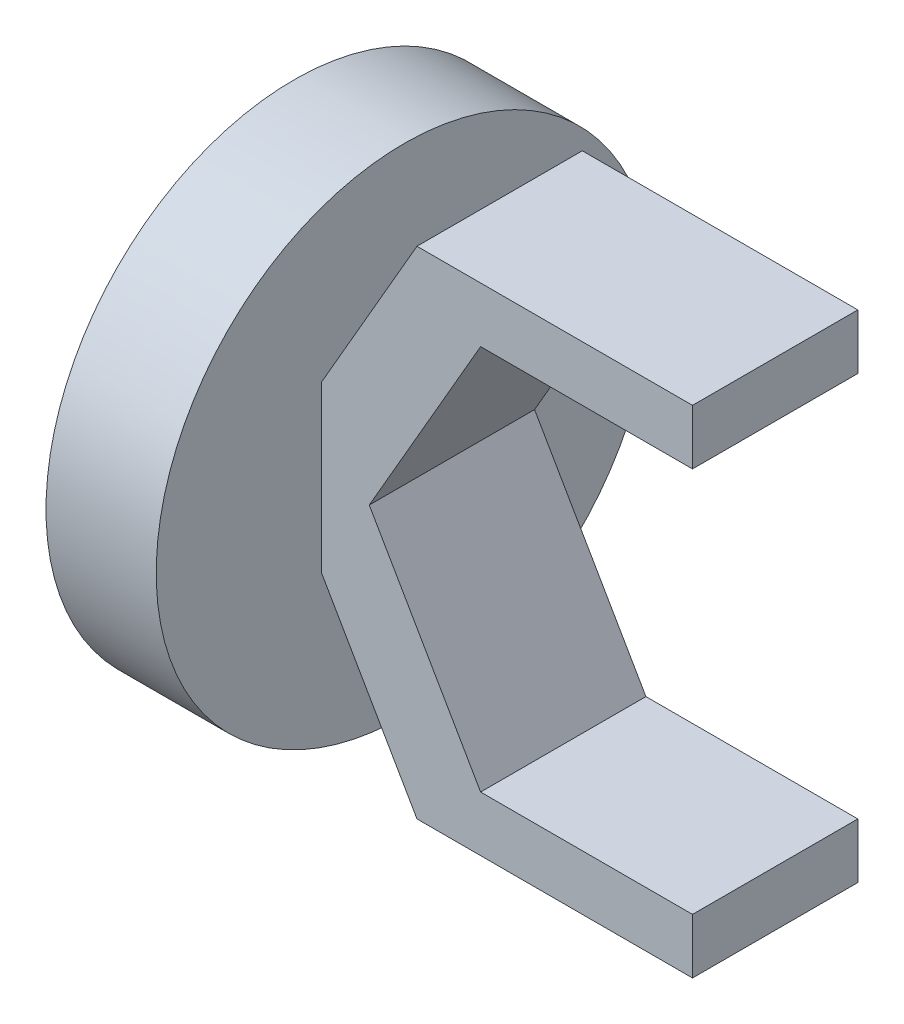
ISO-10303-21;
HEADER;
FILE_DESCRIPTION(('STEP AP214'),'2;1');
FILE_NAME('part.step','',(''),(''),'','','');
FILE_SCHEMA(('AUTOMOTIVE_DESIGN { 1 0 10303 214 1 1 1 1 }'));
ENDSEC;
DATA;
#1=APPLICATION_CONTEXT('core data for automotive mechanical design processes');
#2=APPLICATION_PROTOCOL_DEFINITION('international standard','automotive_design',2000,#1);
#3=PRODUCT_CONTEXT('',#1,'mechanical');
#4=PRODUCT('Part','Part','',(#3));
#5=PRODUCT_RELATED_PRODUCT_CATEGORY('part','',(#4));
#6=PRODUCT_DEFINITION_FORMATION('','',#4);
#7=PRODUCT_DEFINITION_CONTEXT('part definition',#1,'design');
#8=PRODUCT_DEFINITION('design','',#6,#7);
#9=PRODUCT_DEFINITION_SHAPE('','',#8);
#10=(LENGTH_UNIT() NAMED_UNIT(*) SI_UNIT(.MILLI.,.METRE.));
#11=(NAMED_UNIT(*) PLANE_ANGLE_UNIT() SI_UNIT($,.RADIAN.));
#12=(NAMED_UNIT(*) SI_UNIT($,.STERADIAN.) SOLID_ANGLE_UNIT());
#13=UNCERTAINTY_MEASURE_WITH_UNIT(LENGTH_MEASURE(1.E-05),#10,'distance_accuracy_value','');
#14=(GEOMETRIC_REPRESENTATION_CONTEXT(3) GLOBAL_UNCERTAINTY_ASSIGNED_CONTEXT((#13)) GLOBAL_UNIT_ASSIGNED_CONTEXT((#10,
#11,#12)) REPRESENTATION_CONTEXT('',''));
#15=CARTESIAN_POINT('',(0.,0.,0.));
#16=DIRECTION('',(0.,0.,1.));
#17=DIRECTION('',(1.,0.,0.));
#18=AXIS2_PLACEMENT_3D('',#15,#16,#17);
#19=CARTESIAN_POINT('',(20.,0.,0.));
#20=DIRECTION('',(1.,0.,0.));
#21=DIRECTION('',(0.,0.,-1.));
#22=AXIS2_PLACEMENT_3D('',#19,#20,#21);
#23=PLANE('',#22);
#24=CARTESIAN_POINT('',(20.,0.,0.));
#25=DIRECTION('',(1.,0.,0.));
#26=DIRECTION('',(0.,0.,-1.));
#27=AXIS2_PLACEMENT_3D('',#24,#25,#26);
#28=CIRCLE('',#27,45.);
#29=CARTESIAN_POINT('',(20.,0.,-45.));
#30=VERTEX_POINT('',#29);
#31=EDGE_CURVE('E11',#30,#30,#28,.T.);
#32=ORIENTED_EDGE('',*,*,#31,.T.);
#33=EDGE_LOOP('',(#32));
#34=FACE_BOUND('',#33,.T.);
#35=DIRECTION('',(0.,0.,1.));
#36=VECTOR('',#35,1.);
#37=CARTESIAN_POINT('',(20.,15.,-15.));
#38=LINE('',#37,#36);
#39=CARTESIAN_POINT('',(20.,14.9999999999999,-15.));
#40=VERTEX_POINT('',#39);
#41=CARTESIAN_POINT('',(20.,15.,15.));
#42=VERTEX_POINT('',#41);
#43=EDGE_CURVE('E55',#40,#42,#38,.T.);
#44=ORIENTED_EDGE('',*,*,#43,.F.);
#45=DIRECTION('',(0.,-1.,0.));
#46=VECTOR('',#45,1.);
#47=CARTESIAN_POINT('',(20.,15.,-15.));
#48=LINE('',#47,#46);
#49=CARTESIAN_POINT('',(20.,-15.,-15.));
#50=VERTEX_POINT('',#49);
#51=EDGE_CURVE('E59',#40,#50,#48,.T.);
#52=ORIENTED_EDGE('',*,*,#51,.T.);
#53=DIRECTION('',(0.,0.,1.));
#54=VECTOR('',#53,1.);
#55=CARTESIAN_POINT('',(20.,-15.,-15.));
#56=LINE('',#55,#54);
#57=CARTESIAN_POINT('',(20.,-15.,15.));
#58=VERTEX_POINT('',#57);
#59=EDGE_CURVE('E118',#50,#58,#56,.T.);
#60=ORIENTED_EDGE('',*,*,#59,.T.);
#61=DIRECTION('',(0.,-1.,0.));
#62=VECTOR('',#61,1.);
#63=CARTESIAN_POINT('',(20.,15.,15.));
#64=LINE('',#63,#62);
#65=EDGE_CURVE('E121',#42,#58,#64,.T.);
#66=ORIENTED_EDGE('',*,*,#65,.F.);
#67=EDGE_LOOP('',(#44,#52,#60,#66));
#68=FACE_BOUND('',#67,.T.);
#69=ADVANCED_FACE('F39',(#34,#68),#23,.T.);
#70=CARTESIAN_POINT('',(0.,0.,0.));
#71=DIRECTION('',(1.,0.,0.));
#72=DIRECTION('',(0.,0.,-1.));
#73=AXIS2_PLACEMENT_3D('',#70,#71,#72);
#74=PLANE('',#73);
#75=CARTESIAN_POINT('',(0.,0.,0.));
#76=DIRECTION('',(1.,0.,0.));
#77=DIRECTION('',(0.,0.,-1.));
#78=AXIS2_PLACEMENT_3D('',#75,#76,#77);
#79=CIRCLE('',#78,45.);
#80=CARTESIAN_POINT('',(0.,0.,-45.));
#81=VERTEX_POINT('',#80);
#82=EDGE_CURVE('E43',#81,#81,#79,.T.);
#83=ORIENTED_EDGE('',*,*,#82,.F.);
#84=EDGE_LOOP('',(#83));
#85=FACE_BOUND('',#84,.T.);
#86=CARTESIAN_POINT('',(0.,0.,0.));
#87=DIRECTION('',(1.,0.,0.));
#88=DIRECTION('',(0.,0.,-1.));
#89=AXIS2_PLACEMENT_3D('',#86,#87,#88);
#90=CIRCLE('',#89,10.);
#91=CARTESIAN_POINT('',(0.,0.,-10.));
#92=VERTEX_POINT('',#91);
#93=EDGE_CURVE('E249',#92,#92,#90,.T.);
#94=ORIENTED_EDGE('',*,*,#93,.T.);
#95=EDGE_LOOP('',(#94));
#96=FACE_BOUND('',#95,.T.);
#97=ADVANCED_FACE('F259',(#85,#96),#74,.F.);
#98=CARTESIAN_POINT('',(20.,0.,0.));
#99=DIRECTION('',(-1.,0.,0.));
#100=DIRECTION('',(0.,0.,1.));
#101=AXIS2_PLACEMENT_3D('',#98,#99,#100);
#102=CYLINDRICAL_SURFACE('',#101,45.);
#103=ORIENTED_EDGE('',*,*,#31,.F.);
#104=EDGE_LOOP('',(#103));
#105=FACE_BOUND('',#104,.T.);
#106=ORIENTED_EDGE('',*,*,#82,.T.);
#107=EDGE_LOOP('',(#106));
#108=FACE_BOUND('',#107,.T.);
#109=ADVANCED_FACE('F41',(#105,#108),#102,.T.);
#110=CARTESIAN_POINT('',(20.,0.,0.));
#111=DIRECTION('',(-1.,0.,0.));
#112=DIRECTION('',(0.,0.,1.));
#113=AXIS2_PLACEMENT_3D('',#110,#111,#112);
#114=CYLINDRICAL_SURFACE('',#113,10.);
#115=CARTESIAN_POINT('',(20.,0.,0.));
#116=DIRECTION('',(-1.,0.,0.));
#117=DIRECTION('',(0.,-1.,0.));
#118=AXIS2_PLACEMENT_3D('',#115,#116,#117);
#119=CIRCLE('',#118,10.);
#120=CARTESIAN_POINT('',(20.,-10.,0.));
#121=VERTEX_POINT('',#120);
#122=EDGE_CURVE('E219',#121,#121,#119,.T.);
#123=ORIENTED_EDGE('',*,*,#122,.F.);
#124=EDGE_LOOP('',(#123));
#125=FACE_BOUND('',#124,.T.);
#126=ORIENTED_EDGE('',*,*,#93,.F.);
#127=EDGE_LOOP('',(#126));
#128=FACE_BOUND('',#127,.T.);
#129=ADVANCED_FACE('F265',(#125,#128),#114,.F.);
#130=CARTESIAN_POINT('',(20.,15.,-15.));
#131=DIRECTION('',(-1.,0.,0.));
#132=DIRECTION('',(0.,-1.,0.));
#133=AXIS2_PLACEMENT_3D('',#130,#131,#132);
#134=PLANE('',#133);
#135=ORIENTED_EDGE('',*,*,#122,.T.);
#136=EDGE_LOOP('',(#135));
#137=FACE_BOUND('',#136,.T.);
#138=ADVANCED_FACE('F272',(#137),#134,.T.);
#139=CARTESIAN_POINT('',(20.,15.,-15.));
#140=DIRECTION('',(-0.866025403784437,0.500000000000003,0.));
#141=DIRECTION('',(-0.500000000000003,-0.866025403784437,0.));
#142=AXIS2_PLACEMENT_3D('',#139,#140,#141);
#143=PLANE('',#142);
#144=ORIENTED_EDGE('',*,*,#43,.T.);
#145=DIRECTION('',(-0.500000000000003,-0.866025403784437,0.));
#146=VECTOR('',#145,1.);
#147=CARTESIAN_POINT('',(20.,15.,15.));
#148=LINE('',#147,#146);
#149=CARTESIAN_POINT('',(37.3205080756889,44.9999999999999,15.));
#150=VERTEX_POINT('',#149);
#151=EDGE_CURVE('E142',#150,#42,#148,.T.);
#152=ORIENTED_EDGE('',*,*,#151,.F.);
#153=DIRECTION('',(0.,0.,1.));
#154=VECTOR('',#153,1.);
#155=CARTESIAN_POINT('',(37.3205080756889,44.9999999999999,-15.));
#156=LINE('',#155,#154);
#157=CARTESIAN_POINT('',(37.3205080756889,44.9999999999999,-15.));
#158=VERTEX_POINT('',#157);
#159=EDGE_CURVE('E220',#158,#150,#156,.T.);
#160=ORIENTED_EDGE('',*,*,#159,.F.);
#161=DIRECTION('',(-0.500000000000003,-0.866025403784437,0.));
#162=VECTOR('',#161,1.);
#163=CARTESIAN_POINT('',(20.,15.,-15.));
#164=LINE('',#163,#162);
#165=EDGE_CURVE('E127',#158,#40,#164,.T.);
#166=ORIENTED_EDGE('',*,*,#165,.T.);
#167=EDGE_LOOP('',(#144,#152,#160,#166));
#168=FACE_BOUND('',#167,.T.);
#169=ADVANCED_FACE('F276',(#168),#143,.T.);
#170=CARTESIAN_POINT('',(37.3205080756889,44.9999999999999,-15.));
#171=DIRECTION('',(0.,1.,0.));
#172=DIRECTION('',(-1.,0.,0.));
#173=AXIS2_PLACEMENT_3D('',#170,#171,#172);
#174=PLANE('',#173);
#175=ORIENTED_EDGE('',*,*,#159,.T.);
#176=DIRECTION('',(-1.,0.,0.));
#177=VECTOR('',#176,1.);
#178=CARTESIAN_POINT('',(37.3205080756889,44.9999999999999,15.));
#179=LINE('',#178,#177);
#180=CARTESIAN_POINT('',(87.3205080756889,44.9999999999997,15.));
#181=VERTEX_POINT('',#180);
#182=EDGE_CURVE('E172',#181,#150,#179,.T.);
#183=ORIENTED_EDGE('',*,*,#182,.F.);
#184=DIRECTION('',(0.,0.,1.));
#185=VECTOR('',#184,1.);
#186=CARTESIAN_POINT('',(87.3205080756889,44.9999999999997,-15.));
#187=LINE('',#186,#185);
#188=CARTESIAN_POINT('',(87.3205080756889,44.9999999999997,-15.));
#189=VERTEX_POINT('',#188);
#190=EDGE_CURVE('E223',#189,#181,#187,.T.);
#191=ORIENTED_EDGE('',*,*,#190,.F.);
#192=DIRECTION('',(-1.,0.,0.));
#193=VECTOR('',#192,1.);
#194=CARTESIAN_POINT('',(37.3205080756889,44.9999999999999,-15.));
#195=LINE('',#194,#193);
#196=EDGE_CURVE('E210',#189,#158,#195,.T.);
#197=ORIENTED_EDGE('',*,*,#196,.T.);
#198=EDGE_LOOP('',(#175,#183,#191,#197));
#199=FACE_BOUND('',#198,.T.);
#200=ADVANCED_FACE('F308',(#199),#174,.T.);
#201=CARTESIAN_POINT('',(87.3205080756889,44.9999999999997,-15.));
#202=DIRECTION('',(1.,0.,0.));
#203=DIRECTION('',(0.,1.,0.));
#204=AXIS2_PLACEMENT_3D('',#201,#202,#203);
#205=PLANE('',#204);
#206=ORIENTED_EDGE('',*,*,#190,.T.);
#207=DIRECTION('',(0.,1.,0.));
#208=VECTOR('',#207,1.);
#209=CARTESIAN_POINT('',(87.3205080756889,44.9999999999997,15.));
#210=LINE('',#209,#208);
#211=CARTESIAN_POINT('',(87.3205080756889,34.9999999999997,15.));
#212=VERTEX_POINT('',#211);
#213=EDGE_CURVE('E168',#212,#181,#210,.T.);
#214=ORIENTED_EDGE('',*,*,#213,.F.);
#215=DIRECTION('',(0.,0.,1.));
#216=VECTOR('',#215,1.);
#217=CARTESIAN_POINT('',(87.3205080756889,34.9999999999997,-15.));
#218=LINE('',#217,#216);
#219=CARTESIAN_POINT('',(87.3205080756889,34.9999999999997,-15.));
#220=VERTEX_POINT('',#219);
#221=EDGE_CURVE('E226',#220,#212,#218,.T.);
#222=ORIENTED_EDGE('',*,*,#221,.F.);
#223=DIRECTION('',(0.,1.,0.));
#224=VECTOR('',#223,1.);
#225=CARTESIAN_POINT('',(87.3205080756889,44.9999999999997,-15.));
#226=LINE('',#225,#224);
#227=EDGE_CURVE('E206',#220,#189,#226,.T.);
#228=ORIENTED_EDGE('',*,*,#227,.T.);
#229=EDGE_LOOP('',(#206,#214,#222,#228));
#230=FACE_BOUND('',#229,.T.);
#231=ADVANCED_FACE('F304',(#230),#205,.T.);
#232=CARTESIAN_POINT('',(48.8675134594814,34.9999999999999,-15.));
#233=DIRECTION('',(0.,-1.,0.));
#234=DIRECTION('',(1.,0.,0.));
#235=AXIS2_PLACEMENT_3D('',#232,#233,#234);
#236=PLANE('',#235);
#237=ORIENTED_EDGE('',*,*,#221,.T.);
#238=DIRECTION('',(1.,0.,0.));
#239=VECTOR('',#238,1.);
#240=CARTESIAN_POINT('',(48.8675134594814,34.9999999999999,15.));
#241=LINE('',#240,#239);
#242=CARTESIAN_POINT('',(48.8675134594814,34.9999999999999,15.));
#243=VERTEX_POINT('',#242);
#244=EDGE_CURVE('E164',#243,#212,#241,.T.);
#245=ORIENTED_EDGE('',*,*,#244,.F.);
#246=DIRECTION('',(0.,0.,1.));
#247=VECTOR('',#246,1.);
#248=CARTESIAN_POINT('',(48.8675134594814,34.9999999999999,-15.));
#249=LINE('',#248,#247);
#250=CARTESIAN_POINT('',(48.8675134594814,34.9999999999999,-15.));
#251=VERTEX_POINT('',#250);
#252=EDGE_CURVE('E229',#251,#243,#249,.T.);
#253=ORIENTED_EDGE('',*,*,#252,.F.);
#254=DIRECTION('',(1.,0.,0.));
#255=VECTOR('',#254,1.);
#256=CARTESIAN_POINT('',(48.8675134594814,34.9999999999999,-15.));
#257=LINE('',#256,#255);
#258=EDGE_CURVE('E202',#251,#220,#257,.T.);
#259=ORIENTED_EDGE('',*,*,#258,.T.);
#260=EDGE_LOOP('',(#237,#245,#253,#259));
#261=FACE_BOUND('',#260,.T.);
#262=ADVANCED_FACE('F300',(#261),#236,.T.);
#263=CARTESIAN_POINT('',(48.8675134594814,34.9999999999999,-15.));
#264=DIRECTION('',(0.866025403784067,-0.500000000000644,0.));
#265=DIRECTION('',(0.500000000000644,0.866025403784067,0.));
#266=AXIS2_PLACEMENT_3D('',#263,#264,#265);
#267=PLANE('',#266);
#268=ORIENTED_EDGE('',*,*,#252,.T.);
#269=DIRECTION('',(0.500000000000644,0.866025403784067,0.));
#270=VECTOR('',#269,1.);
#271=CARTESIAN_POINT('',(48.8675134594814,34.9999999999999,15.));
#272=LINE('',#271,#270);
#273=CARTESIAN_POINT('',(28.6602540378169,1.22469986625975E-11,15.));
#274=VERTEX_POINT('',#273);
#275=EDGE_CURVE('E160',#274,#243,#272,.T.);
#276=ORIENTED_EDGE('',*,*,#275,.F.);
#277=DIRECTION('',(0.,0.,1.));
#278=VECTOR('',#277,1.);
#279=CARTESIAN_POINT('',(28.6602540378169,1.22469986625975E-11,-15.));
#280=LINE('',#279,#278);
#281=CARTESIAN_POINT('',(28.6602540378169,1.22469986625975E-11,-15.));
#282=VERTEX_POINT('',#281);
#283=EDGE_CURVE('E232',#282,#274,#280,.T.);
#284=ORIENTED_EDGE('',*,*,#283,.F.);
#285=DIRECTION('',(0.500000000000644,0.866025403784067,0.));
#286=VECTOR('',#285,1.);
#287=CARTESIAN_POINT('',(48.8675134594814,34.9999999999999,-15.));
#288=LINE('',#287,#286);
#289=EDGE_CURVE('E198',#282,#251,#288,.T.);
#290=ORIENTED_EDGE('',*,*,#289,.T.);
#291=EDGE_LOOP('',(#268,#276,#284,#290));
#292=FACE_BOUND('',#291,.T.);
#293=ADVANCED_FACE('F296',(#292),#267,.T.);
#294=CARTESIAN_POINT('',(48.8675134594813,-35.,-15.));
#295=DIRECTION('',(0.86602540378422,0.500000000000379,0.));
#296=DIRECTION('',(-0.500000000000379,0.86602540378422,0.));
#297=AXIS2_PLACEMENT_3D('',#294,#295,#296);
#298=PLANE('',#297);
#299=ORIENTED_EDGE('',*,*,#283,.T.);
#300=DIRECTION('',(-0.500000000000379,0.86602540378422,0.));
#301=VECTOR('',#300,1.);
#302=CARTESIAN_POINT('',(48.8675134594813,-35.,15.));
#303=LINE('',#302,#301);
#304=CARTESIAN_POINT('',(48.8675134594813,-35.,15.));
#305=VERTEX_POINT('',#304);
#306=EDGE_CURVE('E156',#305,#274,#303,.T.);
#307=ORIENTED_EDGE('',*,*,#306,.F.);
#308=DIRECTION('',(0.,0.,1.));
#309=VECTOR('',#308,1.);
#310=CARTESIAN_POINT('',(48.8675134594813,-35.,-15.));
#311=LINE('',#310,#309);
#312=CARTESIAN_POINT('',(48.8675134594813,-35.,-15.));
#313=VERTEX_POINT('',#312);
#314=EDGE_CURVE('E235',#313,#305,#311,.T.);
#315=ORIENTED_EDGE('',*,*,#314,.F.);
#316=DIRECTION('',(-0.500000000000379,0.86602540378422,0.));
#317=VECTOR('',#316,1.);
#318=CARTESIAN_POINT('',(48.8675134594813,-35.,-15.));
#319=LINE('',#318,#317);
#320=EDGE_CURVE('E194',#313,#282,#319,.T.);
#321=ORIENTED_EDGE('',*,*,#320,.T.);
#322=EDGE_LOOP('',(#299,#307,#315,#321));
#323=FACE_BOUND('',#322,.T.);
#324=ADVANCED_FACE('F292',(#323),#298,.T.);
#325=CARTESIAN_POINT('',(48.8675134594813,-35.,-15.));
#326=DIRECTION('',(0.,1.,0.));
#327=DIRECTION('',(0.,0.,1.));
#328=AXIS2_PLACEMENT_3D('',#325,#326,#327);
#329=PLANE('',#328);
#330=ORIENTED_EDGE('',*,*,#314,.T.);
#331=DIRECTION('',(-1.,0.,0.));
#332=VECTOR('',#331,1.);
#333=CARTESIAN_POINT('',(48.8675134594813,-35.,15.));
#334=LINE('',#333,#332);
#335=CARTESIAN_POINT('',(87.3205080756888,-35.,15.));
#336=VERTEX_POINT('',#335);
#337=EDGE_CURVE('E152',#336,#305,#334,.T.);
#338=ORIENTED_EDGE('',*,*,#337,.F.);
#339=DIRECTION('',(0.,0.,1.));
#340=VECTOR('',#339,1.);
#341=CARTESIAN_POINT('',(87.3205080756888,-35.,-15.));
#342=LINE('',#341,#340);
#343=CARTESIAN_POINT('',(87.3205080756888,-35.,-15.));
#344=VERTEX_POINT('',#343);
#345=EDGE_CURVE('E238',#344,#336,#342,.T.);
#346=ORIENTED_EDGE('',*,*,#345,.F.);
#347=DIRECTION('',(-1.,0.,0.));
#348=VECTOR('',#347,1.);
#349=CARTESIAN_POINT('',(48.8675134594813,-35.,-15.));
#350=LINE('',#349,#348);
#351=EDGE_CURVE('E190',#344,#313,#350,.T.);
#352=ORIENTED_EDGE('',*,*,#351,.T.);
#353=EDGE_LOOP('',(#330,#338,#346,#352));
#354=FACE_BOUND('',#353,.T.);
#355=ADVANCED_FACE('F288',(#354),#329,.T.);
#356=CARTESIAN_POINT('',(87.3205080756888,-45.,-15.));
#357=DIRECTION('',(1.,0.,0.));
#358=DIRECTION('',(0.,0.,-1.));
#359=AXIS2_PLACEMENT_3D('',#356,#357,#358);
#360=PLANE('',#359);
#361=ORIENTED_EDGE('',*,*,#345,.T.);
#362=DIRECTION('',(0.,1.,0.));
#363=VECTOR('',#362,1.);
#364=CARTESIAN_POINT('',(87.3205080756888,-45.,15.));
#365=LINE('',#364,#363);
#366=CARTESIAN_POINT('',(87.3205080756888,-45.,15.));
#367=VERTEX_POINT('',#366);
#368=EDGE_CURVE('E148',#367,#336,#365,.T.);
#369=ORIENTED_EDGE('',*,*,#368,.F.);
#370=DIRECTION('',(0.,0.,1.));
#371=VECTOR('',#370,1.);
#372=CARTESIAN_POINT('',(87.3205080756888,-45.,-15.));
#373=LINE('',#372,#371);
#374=CARTESIAN_POINT('',(87.3205080756888,-45.,-15.));
#375=VERTEX_POINT('',#374);
#376=EDGE_CURVE('E241',#375,#367,#373,.T.);
#377=ORIENTED_EDGE('',*,*,#376,.F.);
#378=DIRECTION('',(0.,1.,0.));
#379=VECTOR('',#378,1.);
#380=CARTESIAN_POINT('',(87.3205080756888,-45.,-15.));
#381=LINE('',#380,#379);
#382=EDGE_CURVE('E186',#375,#344,#381,.T.);
#383=ORIENTED_EDGE('',*,*,#382,.T.);
#384=EDGE_LOOP('',(#361,#369,#377,#383));
#385=FACE_BOUND('',#384,.T.);
#386=ADVANCED_FACE('F284',(#385),#360,.T.);
#387=CARTESIAN_POINT('',(37.3205080756888,-45.,-15.));
#388=DIRECTION('',(0.,-1.,0.));
#389=DIRECTION('',(0.,0.,-1.));
#390=AXIS2_PLACEMENT_3D('',#387,#388,#389);
#391=PLANE('',#390);
#392=ORIENTED_EDGE('',*,*,#376,.T.);
#393=DIRECTION('',(1.,0.,0.));
#394=VECTOR('',#393,1.);
#395=CARTESIAN_POINT('',(37.3205080756888,-45.,15.));
#396=LINE('',#395,#394);
#397=CARTESIAN_POINT('',(37.3205080756888,-45.,15.));
#398=VERTEX_POINT('',#397);
#399=EDGE_CURVE('E136',#398,#367,#396,.T.);
#400=ORIENTED_EDGE('',*,*,#399,.F.);
#401=DIRECTION('',(0.,0.,1.));
#402=VECTOR('',#401,1.);
#403=CARTESIAN_POINT('',(37.3205080756888,-45.,-15.));
#404=LINE('',#403,#402);
#405=CARTESIAN_POINT('',(37.3205080756888,-45.,-15.));
#406=VERTEX_POINT('',#405);
#407=EDGE_CURVE('E126',#406,#398,#404,.T.);
#408=ORIENTED_EDGE('',*,*,#407,.F.);
#409=DIRECTION('',(1.,0.,0.));
#410=VECTOR('',#409,1.);
#411=CARTESIAN_POINT('',(37.3205080756888,-45.,-15.));
#412=LINE('',#411,#410);
#413=EDGE_CURVE('E182',#406,#375,#412,.T.);
#414=ORIENTED_EDGE('',*,*,#413,.T.);
#415=EDGE_LOOP('',(#392,#400,#408,#414));
#416=FACE_BOUND('',#415,.T.);
#417=ADVANCED_FACE('F281',(#416),#391,.T.);
#418=CARTESIAN_POINT('',(20.,-15.,-15.));
#419=DIRECTION('',(-0.866025403784439,-0.5,0.));
#420=DIRECTION('',(0.5,-0.866025403784439,0.));
#421=AXIS2_PLACEMENT_3D('',#418,#419,#420);
#422=PLANE('',#421);
#423=ORIENTED_EDGE('',*,*,#407,.T.);
#424=DIRECTION('',(0.5,-0.866025403784439,0.));
#425=VECTOR('',#424,1.);
#426=CARTESIAN_POINT('',(20.,-15.,15.));
#427=LINE('',#426,#425);
#428=EDGE_CURVE('E130',#58,#398,#427,.T.);
#429=ORIENTED_EDGE('',*,*,#428,.F.);
#430=ORIENTED_EDGE('',*,*,#59,.F.);
#431=DIRECTION('',(0.5,-0.866025403784439,0.));
#432=VECTOR('',#431,1.);
#433=CARTESIAN_POINT('',(20.,-15.,-15.));
#434=LINE('',#433,#432);
#435=EDGE_CURVE('E179',#50,#406,#434,.T.);
#436=ORIENTED_EDGE('',*,*,#435,.T.);
#437=EDGE_LOOP('',(#423,#429,#430,#436));
#438=FACE_BOUND('',#437,.T.);
#439=ADVANCED_FACE('F131',(#438),#422,.T.);
#440=CARTESIAN_POINT('',(0.,0.,-15.));
#441=DIRECTION('',(0.,0.,1.));
#442=DIRECTION('',(1.,0.,0.));
#443=AXIS2_PLACEMENT_3D('',#440,#441,#442);
#444=PLANE('',#443);
#445=ORIENTED_EDGE('',*,*,#51,.F.);
#446=ORIENTED_EDGE('',*,*,#165,.F.);
#447=ORIENTED_EDGE('',*,*,#196,.F.);
#448=ORIENTED_EDGE('',*,*,#227,.F.);
#449=ORIENTED_EDGE('',*,*,#258,.F.);
#450=ORIENTED_EDGE('',*,*,#289,.F.);
#451=ORIENTED_EDGE('',*,*,#320,.F.);
#452=ORIENTED_EDGE('',*,*,#351,.F.);
#453=ORIENTED_EDGE('',*,*,#382,.F.);
#454=ORIENTED_EDGE('',*,*,#413,.F.);
#455=ORIENTED_EDGE('',*,*,#435,.F.);
#456=EDGE_LOOP('',(#445,#446,#447,#448,#449,#450,#451,#452,#453,#454,#455));
#457=FACE_BOUND('',#456,.T.);
#458=ADVANCED_FACE('F280',(#457),#444,.F.);
#459=CARTESIAN_POINT('',(0.,0.,15.));
#460=DIRECTION('',(0.,0.,1.));
#461=DIRECTION('',(1.,0.,0.));
#462=AXIS2_PLACEMENT_3D('',#459,#460,#461);
#463=PLANE('',#462);
#464=ORIENTED_EDGE('',*,*,#65,.T.);
#465=ORIENTED_EDGE('',*,*,#428,.T.);
#466=ORIENTED_EDGE('',*,*,#399,.T.);
#467=ORIENTED_EDGE('',*,*,#368,.T.);
#468=ORIENTED_EDGE('',*,*,#337,.T.);
#469=ORIENTED_EDGE('',*,*,#306,.T.);
#470=ORIENTED_EDGE('',*,*,#275,.T.);
#471=ORIENTED_EDGE('',*,*,#244,.T.);
#472=ORIENTED_EDGE('',*,*,#213,.T.);
#473=ORIENTED_EDGE('',*,*,#182,.T.);
#474=ORIENTED_EDGE('',*,*,#151,.T.);
#475=EDGE_LOOP('',(#464,#465,#466,#467,#468,#469,#470,#471,#472,#473,#474));
#476=FACE_BOUND('',#475,.T.);
#477=ADVANCED_FACE('F139',(#476),#463,.T.);
#478=CLOSED_SHELL('',(#69,#97,#109,#129,#138,#169,#200,#231,#262,#293,#324,#355,#386,#417,#439,
#458,#477));
#479=MANIFOLD_SOLID_BREP('B2',#478);
#480=ADVANCED_BREP_SHAPE_REPRESENTATION('',(#18,#479),#14);
#481=SHAPE_DEFINITION_REPRESENTATION(#9,#480);
ENDSEC;
END-ISO-10303-21;
